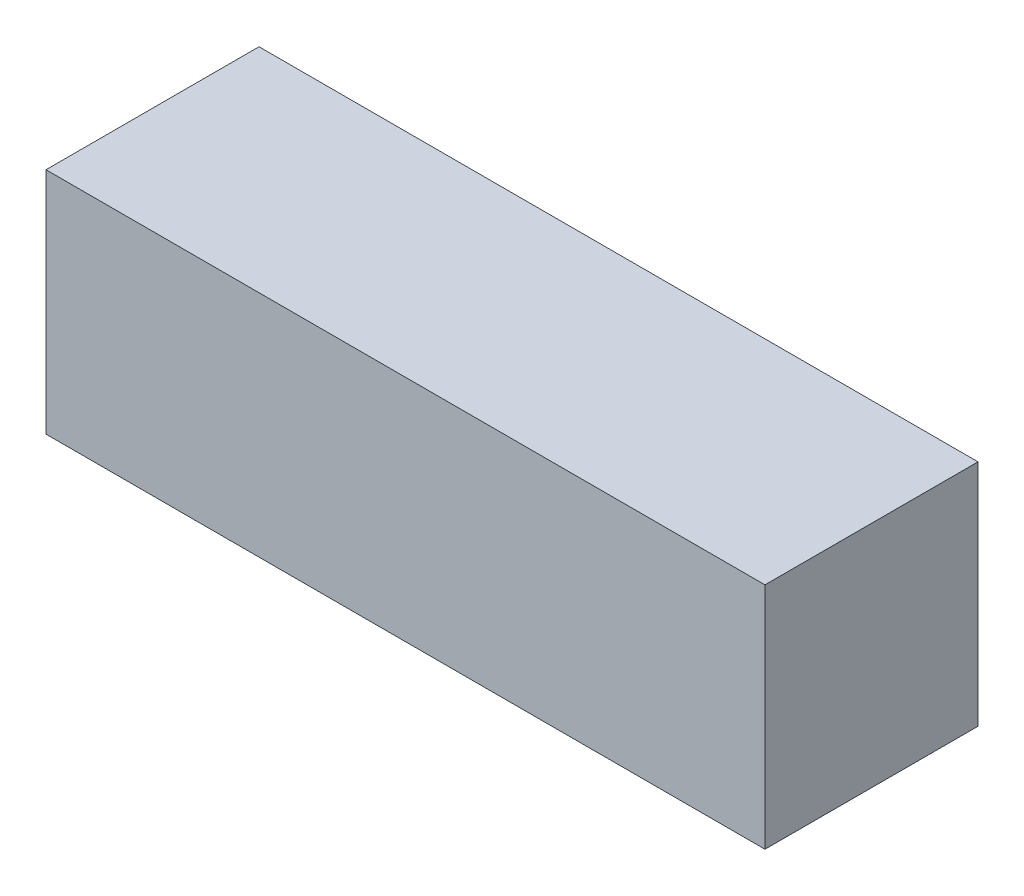
ISO-10303-21;
HEADER;
FILE_DESCRIPTION(('STEP AP214'),'2;1');
FILE_NAME('part.step','',(''),(''),'','','');
FILE_SCHEMA(('AUTOMOTIVE_DESIGN { 1 0 10303 214 1 1 1 1 }'));
ENDSEC;
DATA;
#1=APPLICATION_CONTEXT('core data for automotive mechanical design processes');
#2=APPLICATION_PROTOCOL_DEFINITION('international standard','automotive_design',2000,#1);
#3=PRODUCT_CONTEXT('',#1,'mechanical');
#4=PRODUCT('Part','Part','',(#3));
#5=PRODUCT_RELATED_PRODUCT_CATEGORY('part','',(#4));
#6=PRODUCT_DEFINITION_FORMATION('','',#4);
#7=PRODUCT_DEFINITION_CONTEXT('part definition',#1,'design');
#8=PRODUCT_DEFINITION('design','',#6,#7);
#9=PRODUCT_DEFINITION_SHAPE('','',#8);
#10=(LENGTH_UNIT() NAMED_UNIT(*) SI_UNIT(.MILLI.,.METRE.));
#11=(NAMED_UNIT(*) PLANE_ANGLE_UNIT() SI_UNIT($,.RADIAN.));
#12=(NAMED_UNIT(*) SI_UNIT($,.STERADIAN.) SOLID_ANGLE_UNIT());
#13=UNCERTAINTY_MEASURE_WITH_UNIT(LENGTH_MEASURE(1.E-05),#10,'distance_accuracy_value','');
#14=(GEOMETRIC_REPRESENTATION_CONTEXT(3) GLOBAL_UNCERTAINTY_ASSIGNED_CONTEXT((#13)) GLOBAL_UNIT_ASSIGNED_CONTEXT((#10,
#11,#12)) REPRESENTATION_CONTEXT('',''));
#15=CARTESIAN_POINT('',(0.,0.,0.));
#16=DIRECTION('',(0.,0.,1.));
#17=DIRECTION('',(1.,0.,0.));
#18=AXIS2_PLACEMENT_3D('',#15,#16,#17);
#19=CARTESIAN_POINT('',(67.5,43.,20.));
#20=DIRECTION('',(-1.,0.,0.));
#21=DIRECTION('',(0.,0.,1.));
#22=AXIS2_PLACEMENT_3D('',#19,#20,#21);
#23=PLANE('',#22);
#24=DIRECTION('',(0.,0.,-1.));
#25=VECTOR('',#24,1.);
#26=CARTESIAN_POINT('',(67.5,0.,20.));
#27=LINE('',#26,#25);
#28=CARTESIAN_POINT('',(67.5,0.,20.));
#29=VERTEX_POINT('',#28);
#30=CARTESIAN_POINT('',(67.5,0.,-20.));
#31=VERTEX_POINT('',#30);
#32=EDGE_CURVE('E107',#29,#31,#27,.T.);
#33=ORIENTED_EDGE('',*,*,#32,.T.);
#34=DIRECTION('',(0.,-1.,0.));
#35=VECTOR('',#34,1.);
#36=CARTESIAN_POINT('',(67.5,43.,-20.));
#37=LINE('',#36,#35);
#38=CARTESIAN_POINT('',(67.5,43.,-20.));
#39=VERTEX_POINT('',#38);
#40=EDGE_CURVE('E11',#39,#31,#37,.T.);
#41=ORIENTED_EDGE('',*,*,#40,.F.);
#42=DIRECTION('',(0.,0.,-1.));
#43=VECTOR('',#42,1.);
#44=CARTESIAN_POINT('',(67.5,43.,20.));
#45=LINE('',#44,#43);
#46=CARTESIAN_POINT('',(67.5,43.,20.));
#47=VERTEX_POINT('',#46);
#48=EDGE_CURVE('E91',#47,#39,#45,.T.);
#49=ORIENTED_EDGE('',*,*,#48,.F.);
#50=DIRECTION('',(0.,-1.,0.));
#51=VECTOR('',#50,1.);
#52=CARTESIAN_POINT('',(67.5,43.,20.));
#53=LINE('',#52,#51);
#54=EDGE_CURVE('E103',#47,#29,#53,.T.);
#55=ORIENTED_EDGE('',*,*,#54,.T.);
#56=EDGE_LOOP('',(#33,#41,#49,#55));
#57=FACE_BOUND('',#56,.T.);
#58=ADVANCED_FACE('F39',(#57),#23,.F.);
#59=CARTESIAN_POINT('',(-67.5,43.,-20.));
#60=DIRECTION('',(0.,0.,1.));
#61=DIRECTION('',(1.,0.,0.));
#62=AXIS2_PLACEMENT_3D('',#59,#60,#61);
#63=PLANE('',#62);
#64=DIRECTION('',(-1.,0.,0.));
#65=VECTOR('',#64,1.);
#66=CARTESIAN_POINT('',(-67.5,0.,-20.));
#67=LINE('',#66,#65);
#68=CARTESIAN_POINT('',(-67.5,0.,-20.));
#69=VERTEX_POINT('',#68);
#70=EDGE_CURVE('E96',#31,#69,#67,.T.);
#71=ORIENTED_EDGE('',*,*,#70,.T.);
#72=DIRECTION('',(0.,-1.,0.));
#73=VECTOR('',#72,1.);
#74=CARTESIAN_POINT('',(-67.5,43.,-20.));
#75=LINE('',#74,#73);
#76=CARTESIAN_POINT('',(-67.5,43.,-20.));
#77=VERTEX_POINT('',#76);
#78=EDGE_CURVE('E48',#77,#69,#75,.T.);
#79=ORIENTED_EDGE('',*,*,#78,.F.);
#80=DIRECTION('',(-1.,0.,0.));
#81=VECTOR('',#80,1.);
#82=CARTESIAN_POINT('',(-67.5,43.,-20.));
#83=LINE('',#82,#81);
#84=EDGE_CURVE('E86',#39,#77,#83,.T.);
#85=ORIENTED_EDGE('',*,*,#84,.F.);
#86=ORIENTED_EDGE('',*,*,#40,.T.);
#87=EDGE_LOOP('',(#71,#79,#85,#86));
#88=FACE_BOUND('',#87,.T.);
#89=ADVANCED_FACE('F95',(#88),#63,.F.);
#90=CARTESIAN_POINT('',(-67.5,43.,20.));
#91=DIRECTION('',(1.,0.,0.));
#92=DIRECTION('',(0.,0.,-1.));
#93=AXIS2_PLACEMENT_3D('',#90,#91,#92);
#94=PLANE('',#93);
#95=DIRECTION('',(0.,0.,1.));
#96=VECTOR('',#95,1.);
#97=CARTESIAN_POINT('',(-67.5,0.,20.));
#98=LINE('',#97,#96);
#99=CARTESIAN_POINT('',(-67.5,0.,20.));
#100=VERTEX_POINT('',#99);
#101=EDGE_CURVE('E73',#69,#100,#98,.T.);
#102=ORIENTED_EDGE('',*,*,#101,.T.);
#103=DIRECTION('',(0.,-1.,0.));
#104=VECTOR('',#103,1.);
#105=CARTESIAN_POINT('',(-67.5,43.,20.));
#106=LINE('',#105,#104);
#107=CARTESIAN_POINT('',(-67.5,43.,20.));
#108=VERTEX_POINT('',#107);
#109=EDGE_CURVE('E98',#108,#100,#106,.T.);
#110=ORIENTED_EDGE('',*,*,#109,.F.);
#111=DIRECTION('',(0.,0.,1.));
#112=VECTOR('',#111,1.);
#113=CARTESIAN_POINT('',(-67.5,43.,20.));
#114=LINE('',#113,#112);
#115=EDGE_CURVE('E89',#77,#108,#114,.T.);
#116=ORIENTED_EDGE('',*,*,#115,.F.);
#117=ORIENTED_EDGE('',*,*,#78,.T.);
#118=EDGE_LOOP('',(#102,#110,#116,#117));
#119=FACE_BOUND('',#118,.T.);
#120=ADVANCED_FACE('F99',(#119),#94,.F.);
#121=CARTESIAN_POINT('',(-67.5,43.,20.));
#122=DIRECTION('',(0.,0.,-1.));
#123=DIRECTION('',(-1.,0.,0.));
#124=AXIS2_PLACEMENT_3D('',#121,#122,#123);
#125=PLANE('',#124);
#126=DIRECTION('',(1.,0.,0.));
#127=VECTOR('',#126,1.);
#128=CARTESIAN_POINT('',(-67.5,0.,20.));
#129=LINE('',#128,#127);
#130=EDGE_CURVE('E79',#100,#29,#129,.T.);
#131=ORIENTED_EDGE('',*,*,#130,.T.);
#132=ORIENTED_EDGE('',*,*,#54,.F.);
#133=DIRECTION('',(1.,0.,0.));
#134=VECTOR('',#133,1.);
#135=CARTESIAN_POINT('',(-67.5,43.,20.));
#136=LINE('',#135,#134);
#137=EDGE_CURVE('E56',#108,#47,#136,.T.);
#138=ORIENTED_EDGE('',*,*,#137,.F.);
#139=ORIENTED_EDGE('',*,*,#109,.T.);
#140=EDGE_LOOP('',(#131,#132,#138,#139));
#141=FACE_BOUND('',#140,.T.);
#142=ADVANCED_FACE('F120',(#141),#125,.F.);
#143=CARTESIAN_POINT('',(0.,43.,0.));
#144=DIRECTION('',(0.,-1.,0.));
#145=DIRECTION('',(0.,0.,-1.));
#146=AXIS2_PLACEMENT_3D('',#143,#144,#145);
#147=PLANE('',#146);
#148=ORIENTED_EDGE('',*,*,#48,.T.);
#149=ORIENTED_EDGE('',*,*,#84,.T.);
#150=ORIENTED_EDGE('',*,*,#115,.T.);
#151=ORIENTED_EDGE('',*,*,#137,.T.);
#152=EDGE_LOOP('',(#148,#149,#150,#151));
#153=FACE_BOUND('',#152,.T.);
#154=ADVANCED_FACE('F87',(#153),#147,.F.);
#155=CARTESIAN_POINT('',(0.,0.,0.));
#156=DIRECTION('',(0.,-1.,0.));
#157=DIRECTION('',(0.,0.,-1.));
#158=AXIS2_PLACEMENT_3D('',#155,#156,#157);
#159=PLANE('',#158);
#160=ORIENTED_EDGE('',*,*,#32,.F.);
#161=ORIENTED_EDGE('',*,*,#130,.F.);
#162=ORIENTED_EDGE('',*,*,#101,.F.);
#163=ORIENTED_EDGE('',*,*,#70,.F.);
#164=EDGE_LOOP('',(#160,#161,#162,#163));
#165=FACE_BOUND('',#164,.T.);
#166=ADVANCED_FACE('F123',(#165),#159,.T.);
#167=CLOSED_SHELL('',(#58,#89,#120,#142,#154,#166));
#168=MANIFOLD_SOLID_BREP('B2',#167);
#169=ADVANCED_BREP_SHAPE_REPRESENTATION('',(#18,#168),#14);
#170=SHAPE_DEFINITION_REPRESENTATION(#9,#169);
ENDSEC;
END-ISO-10303-21;
